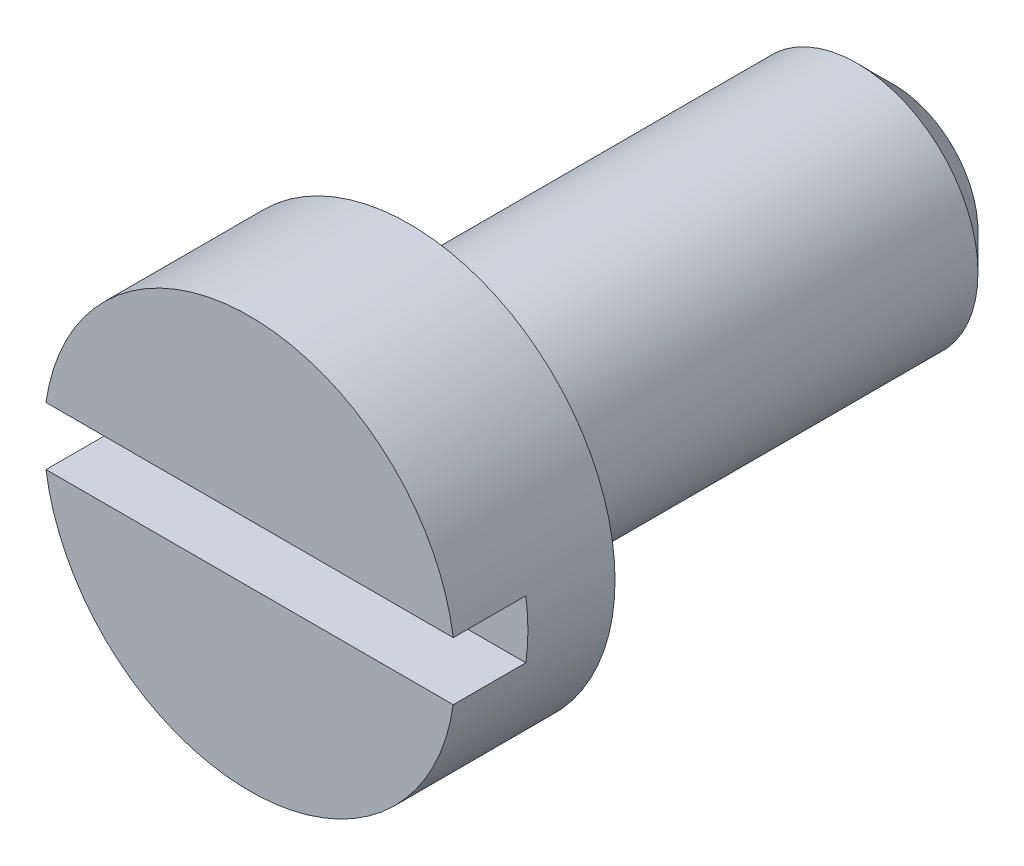
ISO-10303-21;
HEADER;
FILE_DESCRIPTION(('STEP AP214'),'2;1');
FILE_NAME('part.step','',(''),(''),'','','');
FILE_SCHEMA(('AUTOMOTIVE_DESIGN { 1 0 10303 214 1 1 1 1 }'));
ENDSEC;
DATA;
#1=APPLICATION_CONTEXT('core data for automotive mechanical design processes');
#2=APPLICATION_PROTOCOL_DEFINITION('international standard','automotive_design',2000,#1);
#3=PRODUCT_CONTEXT('',#1,'mechanical');
#4=PRODUCT('Part','Part','',(#3));
#5=PRODUCT_RELATED_PRODUCT_CATEGORY('part','',(#4));
#6=PRODUCT_DEFINITION_FORMATION('','',#4);
#7=PRODUCT_DEFINITION_CONTEXT('part definition',#1,'design');
#8=PRODUCT_DEFINITION('design','',#6,#7);
#9=PRODUCT_DEFINITION_SHAPE('','',#8);
#10=(LENGTH_UNIT() NAMED_UNIT(*) SI_UNIT(.MILLI.,.METRE.));
#11=(NAMED_UNIT(*) PLANE_ANGLE_UNIT() SI_UNIT($,.RADIAN.));
#12=(NAMED_UNIT(*) SI_UNIT($,.STERADIAN.) SOLID_ANGLE_UNIT());
#13=UNCERTAINTY_MEASURE_WITH_UNIT(LENGTH_MEASURE(1.E-05),#10,'distance_accuracy_value','');
#14=(GEOMETRIC_REPRESENTATION_CONTEXT(3) GLOBAL_UNCERTAINTY_ASSIGNED_CONTEXT((#13)) GLOBAL_UNIT_ASSIGNED_CONTEXT((#10,
#11,#12)) REPRESENTATION_CONTEXT('',''));
#15=CARTESIAN_POINT('',(0.,0.,0.));
#16=DIRECTION('',(0.,0.,1.));
#17=DIRECTION('',(1.,0.,0.));
#18=AXIS2_PLACEMENT_3D('',#15,#16,#17);
#19=CARTESIAN_POINT('',(0.,0.,3.3));
#20=DIRECTION('',(0.,0.,1.));
#21=DIRECTION('',(1.,0.,0.));
#22=AXIS2_PLACEMENT_3D('',#19,#20,#21);
#23=PLANE('',#22);
#24=DIRECTION('',(-1.,0.,0.));
#25=VECTOR('',#24,1.);
#26=CARTESIAN_POINT('',(0.,0.6,3.3));
#27=LINE('',#26,#25);
#28=CARTESIAN_POINT('',(4.20743389728229,0.6,3.3));
#29=VERTEX_POINT('',#28);
#30=CARTESIAN_POINT('',(-4.20743389728229,0.6,3.3));
#31=VERTEX_POINT('',#30);
#32=EDGE_CURVE('E77',#29,#31,#27,.T.);
#33=ORIENTED_EDGE('',*,*,#32,.F.);
#34=CARTESIAN_POINT('',(0.,0.,3.3));
#35=DIRECTION('',(0.,0.,1.));
#36=DIRECTION('',(1.,0.,0.));
#37=AXIS2_PLACEMENT_3D('',#34,#35,#36);
#38=CIRCLE('',#37,4.25);
#39=EDGE_CURVE('E90',#29,#31,#38,.T.);
#40=ORIENTED_EDGE('',*,*,#39,.T.);
#41=EDGE_LOOP('',(#33,#40));
#42=FACE_BOUND('',#41,.T.);
#43=ADVANCED_FACE('F29',(#42),#23,.T.);
#44=CARTESIAN_POINT('',(0.,0.,0.));
#45=DIRECTION('',(0.,0.,1.));
#46=DIRECTION('',(1.,0.,0.));
#47=AXIS2_PLACEMENT_3D('',#44,#45,#46);
#48=PLANE('',#47);
#49=CARTESIAN_POINT('',(0.,0.,0.));
#50=DIRECTION('',(0.,0.,1.));
#51=DIRECTION('',(1.,0.,0.));
#52=AXIS2_PLACEMENT_3D('',#49,#50,#51);
#53=CIRCLE('',#52,4.25);
#54=CARTESIAN_POINT('',(4.25,0.,0.));
#55=VERTEX_POINT('',#54);
#56=EDGE_CURVE('E91',#55,#55,#53,.T.);
#57=ORIENTED_EDGE('',*,*,#56,.F.);
#58=EDGE_LOOP('',(#57));
#59=FACE_BOUND('',#58,.T.);
#60=CARTESIAN_POINT('',(0.,0.,0.));
#61=DIRECTION('',(0.,0.,1.));
#62=DIRECTION('',(1.,0.,0.));
#63=AXIS2_PLACEMENT_3D('',#60,#61,#62);
#64=CIRCLE('',#63,2.5);
#65=CARTESIAN_POINT('',(2.5,0.,0.));
#66=VERTEX_POINT('',#65);
#67=EDGE_CURVE('E78',#66,#66,#64,.F.);
#68=ORIENTED_EDGE('',*,*,#67,.F.);
#69=EDGE_LOOP('',(#68));
#70=FACE_BOUND('',#69,.T.);
#71=ADVANCED_FACE('F118',(#59,#70),#48,.F.);
#72=CARTESIAN_POINT('',(0.,0.,3.3));
#73=DIRECTION('',(0.,0.,-1.));
#74=DIRECTION('',(-1.,0.,0.));
#75=AXIS2_PLACEMENT_3D('',#72,#73,#74);
#76=CYLINDRICAL_SURFACE('',#75,4.25);
#77=CARTESIAN_POINT('',(0.,0.,1.8));
#78=DIRECTION('',(0.,0.,1.));
#79=DIRECTION('',(1.,0.,0.));
#80=AXIS2_PLACEMENT_3D('',#77,#78,#79);
#81=CIRCLE('',#80,4.25);
#82=CARTESIAN_POINT('',(-4.20743389728229,0.6,1.8));
#83=VERTEX_POINT('',#82);
#84=CARTESIAN_POINT('',(-4.20743389728229,-0.6,1.8));
#85=VERTEX_POINT('',#84);
#86=EDGE_CURVE('E102',#83,#85,#81,.T.);
#87=ORIENTED_EDGE('',*,*,#86,.F.);
#88=DIRECTION('',(0.,0.,-1.));
#89=VECTOR('',#88,1.);
#90=CARTESIAN_POINT('',(-4.20743389728229,0.6,3.3));
#91=LINE('',#90,#89);
#92=EDGE_CURVE('E52',#83,#31,#91,.F.);
#93=ORIENTED_EDGE('',*,*,#92,.T.);
#94=ORIENTED_EDGE('',*,*,#39,.F.);
#95=DIRECTION('',(0.,0.,-1.));
#96=VECTOR('',#95,1.);
#97=CARTESIAN_POINT('',(4.20743389728229,0.6,3.3));
#98=LINE('',#97,#96);
#99=CARTESIAN_POINT('',(4.20743389728229,0.6,1.8));
#100=VERTEX_POINT('',#99);
#101=EDGE_CURVE('E95',#29,#100,#98,.T.);
#102=ORIENTED_EDGE('',*,*,#101,.T.);
#103=CARTESIAN_POINT('',(4.20743389728229,-0.6,1.8));
#104=VERTEX_POINT('',#103);
#105=EDGE_CURVE('E86',#104,#100,#81,.T.);
#106=ORIENTED_EDGE('',*,*,#105,.F.);
#107=DIRECTION('',(0.,0.,-1.));
#108=VECTOR('',#107,1.);
#109=CARTESIAN_POINT('',(4.20743389728229,-0.6,3.3));
#110=LINE('',#109,#108);
#111=CARTESIAN_POINT('',(4.20743389728229,-0.6,3.3));
#112=VERTEX_POINT('',#111);
#113=EDGE_CURVE('E72',#104,#112,#110,.F.);
#114=ORIENTED_EDGE('',*,*,#113,.T.);
#115=CARTESIAN_POINT('',(-4.20743389728229,-0.6,3.3));
#116=VERTEX_POINT('',#115);
#117=EDGE_CURVE('E84',#116,#112,#38,.T.);
#118=ORIENTED_EDGE('',*,*,#117,.F.);
#119=DIRECTION('',(0.,0.,-1.));
#120=VECTOR('',#119,1.);
#121=CARTESIAN_POINT('',(-4.20743389728229,-0.6,3.3));
#122=LINE('',#121,#120);
#123=EDGE_CURVE('E44',#116,#85,#122,.T.);
#124=ORIENTED_EDGE('',*,*,#123,.T.);
#125=EDGE_LOOP('',(#87,#93,#94,#102,#106,#114,#118,#124));
#126=FACE_BOUND('',#125,.T.);
#127=ORIENTED_EDGE('',*,*,#56,.T.);
#128=EDGE_LOOP('',(#127));
#129=FACE_BOUND('',#128,.T.);
#130=ADVANCED_FACE('F31',(#126,#129),#76,.T.);
#131=DIRECTION('',(1.,0.,0.));
#132=VECTOR('',#131,1.);
#133=CARTESIAN_POINT('',(0.,-0.6,3.3));
#134=LINE('',#133,#132);
#135=EDGE_CURVE('E69',#116,#112,#134,.T.);
#136=ORIENTED_EDGE('',*,*,#135,.F.);
#137=ORIENTED_EDGE('',*,*,#117,.T.);
#138=EDGE_LOOP('',(#136,#137));
#139=FACE_BOUND('',#138,.T.);
#140=ADVANCED_FACE('F89',(#139),#23,.T.);
#141=CARTESIAN_POINT('',(0.,0.,-10.));
#142=DIRECTION('',(0.,0.,1.));
#143=DIRECTION('',(1.,0.,0.));
#144=AXIS2_PLACEMENT_3D('',#141,#142,#143);
#145=CYLINDRICAL_SURFACE('',#144,2.5);
#146=CARTESIAN_POINT('',(0.,0.,-9.24999999999999));
#147=DIRECTION('',(0.,0.,-1.));
#148=DIRECTION('',(-1.,0.,0.));
#149=AXIS2_PLACEMENT_3D('',#146,#147,#148);
#150=CIRCLE('',#149,2.5);
#151=CARTESIAN_POINT('',(-2.5,0.,-9.24999999999999));
#152=VERTEX_POINT('',#151);
#153=EDGE_CURVE('E11',#152,#152,#150,.F.);
#154=ORIENTED_EDGE('',*,*,#153,.T.);
#155=EDGE_LOOP('',(#154));
#156=FACE_BOUND('',#155,.T.);
#157=ORIENTED_EDGE('',*,*,#67,.T.);
#158=EDGE_LOOP('',(#157));
#159=FACE_BOUND('',#158,.T.);
#160=ADVANCED_FACE('F126',(#156,#159),#145,.T.);
#161=CARTESIAN_POINT('',(0.,0.,-10.));
#162=DIRECTION('',(0.,0.,-1.));
#163=DIRECTION('',(-1.,0.,0.));
#164=AXIS2_PLACEMENT_3D('',#161,#162,#163);
#165=PLANE('',#164);
#166=CARTESIAN_POINT('',(0.,0.,-10.));
#167=DIRECTION('',(0.,0.,-1.));
#168=DIRECTION('',(-1.,0.,0.));
#169=AXIS2_PLACEMENT_3D('',#166,#167,#168);
#170=CIRCLE('',#169,1.75);
#171=CARTESIAN_POINT('',(-1.75,0.,-10.));
#172=VERTEX_POINT('',#171);
#173=EDGE_CURVE('E37',#172,#172,#170,.T.);
#174=ORIENTED_EDGE('',*,*,#173,.T.);
#175=EDGE_LOOP('',(#174));
#176=FACE_BOUND('',#175,.T.);
#177=ADVANCED_FACE('F131',(#176),#165,.T.);
#178=CARTESIAN_POINT('',(-4.56878306878307,0.6,1.8));
#179=DIRECTION('',(0.,0.,1.));
#180=DIRECTION('',(1.,0.,0.));
#181=AXIS2_PLACEMENT_3D('',#178,#179,#180);
#182=PLANE('',#181);
#183=ORIENTED_EDGE('',*,*,#86,.T.);
#184=DIRECTION('',(1.,0.,0.));
#185=VECTOR('',#184,1.);
#186=CARTESIAN_POINT('',(-4.56878306878307,-0.6,1.8));
#187=LINE('',#186,#185);
#188=EDGE_CURVE('E108',#85,#104,#187,.T.);
#189=ORIENTED_EDGE('',*,*,#188,.T.);
#190=ORIENTED_EDGE('',*,*,#105,.T.);
#191=DIRECTION('',(-1.,0.,0.));
#192=VECTOR('',#191,1.);
#193=CARTESIAN_POINT('',(-4.56878306878307,0.6,1.8));
#194=LINE('',#193,#192);
#195=EDGE_CURVE('E87',#100,#83,#194,.T.);
#196=ORIENTED_EDGE('',*,*,#195,.T.);
#197=EDGE_LOOP('',(#183,#189,#190,#196));
#198=FACE_BOUND('',#197,.T.);
#199=ADVANCED_FACE('F107',(#198),#182,.T.);
#200=CARTESIAN_POINT('',(-4.56878306878307,0.6,1.8));
#201=DIRECTION('',(0.,1.,0.));
#202=DIRECTION('',(0.,0.,1.));
#203=AXIS2_PLACEMENT_3D('',#200,#201,#202);
#204=PLANE('',#203);
#205=ORIENTED_EDGE('',*,*,#32,.T.);
#206=ORIENTED_EDGE('',*,*,#92,.F.);
#207=ORIENTED_EDGE('',*,*,#195,.F.);
#208=ORIENTED_EDGE('',*,*,#101,.F.);
#209=EDGE_LOOP('',(#205,#206,#207,#208));
#210=FACE_BOUND('',#209,.T.);
#211=ADVANCED_FACE('F115',(#210),#204,.F.);
#212=CARTESIAN_POINT('',(-4.56878306878307,-0.6,1.8));
#213=DIRECTION('',(0.,-1.,0.));
#214=DIRECTION('',(1.,0.,0.));
#215=AXIS2_PLACEMENT_3D('',#212,#213,#214);
#216=PLANE('',#215);
#217=ORIENTED_EDGE('',*,*,#135,.T.);
#218=ORIENTED_EDGE('',*,*,#113,.F.);
#219=ORIENTED_EDGE('',*,*,#188,.F.);
#220=ORIENTED_EDGE('',*,*,#123,.F.);
#221=EDGE_LOOP('',(#217,#218,#219,#220));
#222=FACE_BOUND('',#221,.T.);
#223=ADVANCED_FACE('F71',(#222),#216,.F.);
#224=CARTESIAN_POINT('',(0.,0.,-10.));
#225=DIRECTION('',(0.,0.,1.));
#226=DIRECTION('',(1.,0.,0.));
#227=AXIS2_PLACEMENT_3D('',#224,#225,#226);
#228=CONICAL_SURFACE('',#227,1.75,0.785398163397446);
#229=ORIENTED_EDGE('',*,*,#153,.F.);
#230=EDGE_LOOP('',(#229));
#231=FACE_BOUND('',#230,.T.);
#232=ORIENTED_EDGE('',*,*,#173,.F.);
#233=EDGE_LOOP('',(#232));
#234=FACE_BOUND('',#233,.T.);
#235=ADVANCED_FACE('F173',(#231,#234),#228,.T.);
#236=CLOSED_SHELL('',(#43,#71,#130,#140,#160,#177,#199,#211,#223,#235));
#237=MANIFOLD_SOLID_BREP('B2',#236);
#238=ADVANCED_BREP_SHAPE_REPRESENTATION('',(#18,#237),#14);
#239=SHAPE_DEFINITION_REPRESENTATION(#9,#238);
ENDSEC;
END-ISO-10303-21;
